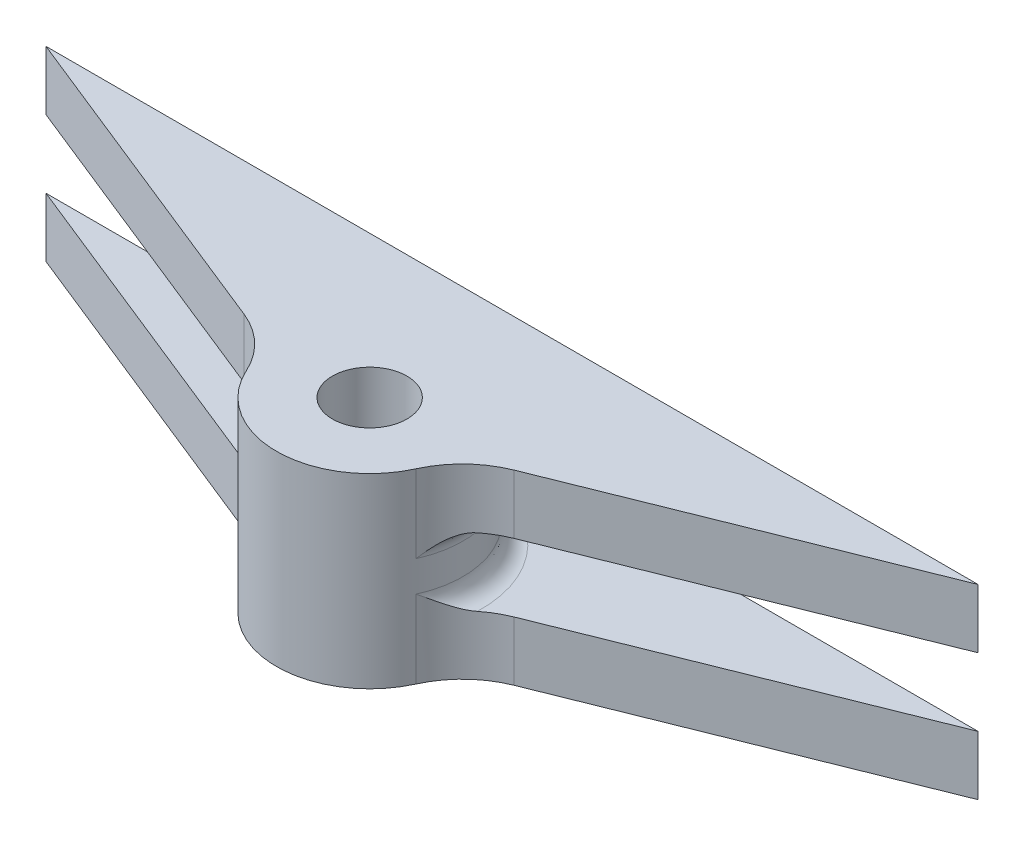
ISO-10303-21;
HEADER;
FILE_DESCRIPTION(('STEP AP214'),'2;1');
FILE_NAME('part.step','',(''),(''),'','','');
FILE_SCHEMA(('AUTOMOTIVE_DESIGN { 1 0 10303 214 1 1 1 1 }'));
ENDSEC;
DATA;
#1=APPLICATION_CONTEXT('core data for automotive mechanical design processes');
#2=APPLICATION_PROTOCOL_DEFINITION('international standard','automotive_design',2000,#1);
#3=PRODUCT_CONTEXT('',#1,'mechanical');
#4=PRODUCT('Part','Part','',(#3));
#5=PRODUCT_RELATED_PRODUCT_CATEGORY('part','',(#4));
#6=PRODUCT_DEFINITION_FORMATION('','',#4);
#7=PRODUCT_DEFINITION_CONTEXT('part definition',#1,'design');
#8=PRODUCT_DEFINITION('design','',#6,#7);
#9=PRODUCT_DEFINITION_SHAPE('','',#8);
#10=(LENGTH_UNIT() NAMED_UNIT(*) SI_UNIT(.MILLI.,.METRE.));
#11=(NAMED_UNIT(*) PLANE_ANGLE_UNIT() SI_UNIT($,.RADIAN.));
#12=(NAMED_UNIT(*) SI_UNIT($,.STERADIAN.) SOLID_ANGLE_UNIT());
#13=UNCERTAINTY_MEASURE_WITH_UNIT(LENGTH_MEASURE(1.E-05),#10,'distance_accuracy_value','');
#14=(GEOMETRIC_REPRESENTATION_CONTEXT(3) GLOBAL_UNCERTAINTY_ASSIGNED_CONTEXT((#13)) GLOBAL_UNIT_ASSIGNED_CONTEXT((#10,
#11,#12)) REPRESENTATION_CONTEXT('',''));
#15=CARTESIAN_POINT('',(0.,0.,0.));
#16=DIRECTION('',(0.,0.,1.));
#17=DIRECTION('',(1.,0.,0.));
#18=AXIS2_PLACEMENT_3D('',#15,#16,#17);
#19=CARTESIAN_POINT('',(13.8867378227828,6.35,34.5808081877734));
#20=DIRECTION('',(-0.372649135552235,0.,-0.927972317352286));
#21=DIRECTION('',(-0.927972317352286,0.,0.372649135552235));
#22=AXIS2_PLACEMENT_3D('',#19,#20,#21);
#23=PLANE('',#22);
#24=DIRECTION('',(0.927972317352286,0.,-0.372649135552235));
#25=VECTOR('',#24,1.);
#26=CARTESIAN_POINT('',(13.8867378227828,6.35,34.5808081877734));
#27=LINE('',#26,#25);
#28=CARTESIAN_POINT('',(64.4822304780552,6.35,14.2629967097085));
#29=VERTEX_POINT('',#28);
#30=CARTESIAN_POINT('',(100.,6.35,0.));
#31=VERTEX_POINT('',#30);
#32=EDGE_CURVE('E189',#29,#31,#27,.T.);
#33=ORIENTED_EDGE('',*,*,#32,.F.);
#34=DIRECTION('',(0.,1.,0.));
#35=VECTOR('',#34,1.);
#36=CARTESIAN_POINT('',(64.4822304780552,0.,14.2629967097085));
#37=LINE('',#36,#35);
#38=CARTESIAN_POINT('',(64.4822304780552,0.,14.2629967097085));
#39=VERTEX_POINT('',#38);
#40=EDGE_CURVE('E209',#29,#39,#37,.F.);
#41=ORIENTED_EDGE('',*,*,#40,.T.);
#42=DIRECTION('',(0.927972317352286,0.,-0.372649135552235));
#43=VECTOR('',#42,1.);
#44=CARTESIAN_POINT('',(13.8867378227828,0.,34.5808081877734));
#45=LINE('',#44,#43);
#46=CARTESIAN_POINT('',(100.,0.,0.));
#47=VERTEX_POINT('',#46);
#48=EDGE_CURVE('E184',#39,#47,#45,.T.);
#49=ORIENTED_EDGE('',*,*,#48,.T.);
#50=DIRECTION('',(0.,-1.,0.));
#51=VECTOR('',#50,1.);
#52=CARTESIAN_POINT('',(100.,6.35,0.));
#53=LINE('',#52,#51);
#54=EDGE_CURVE('E206',#31,#47,#53,.T.);
#55=ORIENTED_EDGE('',*,*,#54,.F.);
#56=EDGE_LOOP('',(#33,#41,#49,#55));
#57=FACE_BOUND('',#56,.T.);
#58=ADVANCED_FACE('F34',(#57),#23,.F.);
#59=CARTESIAN_POINT('',(0.,6.35,0.));
#60=DIRECTION('',(0.,0.,-1.));
#61=DIRECTION('',(-1.,0.,0.));
#62=AXIS2_PLACEMENT_3D('',#59,#60,#61);
#63=PLANE('',#62);
#64=DIRECTION('',(1.,0.,0.));
#65=VECTOR('',#64,1.);
#66=CARTESIAN_POINT('',(0.,0.,0.));
#67=LINE('',#66,#65);
#68=CARTESIAN_POINT('',(0.,0.,0.));
#69=VERTEX_POINT('',#68);
#70=EDGE_CURVE('E200',#69,#47,#67,.T.);
#71=ORIENTED_EDGE('',*,*,#70,.F.);
#72=DIRECTION('',(0.,-1.,0.));
#73=VECTOR('',#72,1.);
#74=CARTESIAN_POINT('',(0.,6.35,0.));
#75=LINE('',#74,#73);
#76=CARTESIAN_POINT('',(0.,6.35,0.));
#77=VERTEX_POINT('',#76);
#78=EDGE_CURVE('E198',#77,#69,#75,.T.);
#79=ORIENTED_EDGE('',*,*,#78,.F.);
#80=DIRECTION('',(1.,0.,0.));
#81=VECTOR('',#80,1.);
#82=CARTESIAN_POINT('',(0.,6.35,0.));
#83=LINE('',#82,#81);
#84=EDGE_CURVE('E191',#77,#31,#83,.T.);
#85=ORIENTED_EDGE('',*,*,#84,.T.);
#86=ORIENTED_EDGE('',*,*,#54,.T.);
#87=EDGE_LOOP('',(#71,#79,#85,#86));
#88=FACE_BOUND('',#87,.T.);
#89=ADVANCED_FACE('F319',(#88),#63,.T.);
#90=CARTESIAN_POINT('',(0.,6.35,0.));
#91=DIRECTION('',(0.372649135552235,0.,-0.927972317352286));
#92=DIRECTION('',(-0.927972317352286,0.,-0.372649135552235));
#93=AXIS2_PLACEMENT_3D('',#90,#91,#92);
#94=PLANE('',#93);
#95=DIRECTION('',(0.927972317352286,0.,0.372649135552235));
#96=VECTOR('',#95,1.);
#97=CARTESIAN_POINT('',(0.,0.,0.));
#98=LINE('',#97,#96);
#99=CARTESIAN_POINT('',(35.5177695219448,0.,14.2629967097085));
#100=VERTEX_POINT('',#99);
#101=EDGE_CURVE('E192',#69,#100,#98,.T.);
#102=ORIENTED_EDGE('',*,*,#101,.T.);
#103=DIRECTION('',(0.,1.,0.));
#104=VECTOR('',#103,1.);
#105=CARTESIAN_POINT('',(35.5177695219448,6.35,14.2629967097085));
#106=LINE('',#105,#104);
#107=CARTESIAN_POINT('',(35.5177695219448,6.35,14.2629967097085));
#108=VERTEX_POINT('',#107);
#109=EDGE_CURVE('E222',#100,#108,#106,.T.);
#110=ORIENTED_EDGE('',*,*,#109,.T.);
#111=DIRECTION('',(0.927972317352286,0.,0.372649135552235));
#112=VECTOR('',#111,1.);
#113=CARTESIAN_POINT('',(0.,6.35,0.));
#114=LINE('',#113,#112);
#115=EDGE_CURVE('E195',#77,#108,#114,.T.);
#116=ORIENTED_EDGE('',*,*,#115,.F.);
#117=ORIENTED_EDGE('',*,*,#78,.T.);
#118=EDGE_LOOP('',(#102,#110,#116,#117));
#119=FACE_BOUND('',#118,.T.);
#120=ADVANCED_FACE('F316',(#119),#94,.F.);
#121=CARTESIAN_POINT('',(0.,6.35,0.));
#122=DIRECTION('',(0.,1.,0.));
#123=DIRECTION('',(0.,0.,1.));
#124=AXIS2_PLACEMENT_3D('',#121,#122,#123);
#125=PLANE('',#124);
#126=CARTESIAN_POINT('',(31.7912781664225,6.35,23.5427198832314));
#127=DIRECTION('',(0.,1.,0.));
#128=DIRECTION('',(0.,0.,1.));
#129=AXIS2_PLACEMENT_3D('',#126,#127,#128);
#130=CIRCLE('',#129,10.);
#131=CARTESIAN_POINT('',(38.0080797720312,6.35,15.7100078499379));
#132=VERTEX_POINT('',#131);
#133=EDGE_CURVE('E234',#108,#132,#130,.F.);
#134=ORIENTED_EDGE('',*,*,#133,.T.);
#135=CARTESIAN_POINT('',(50.,6.35,15.2697247069124));
#136=DIRECTION('',(0.,1.,0.));
#137=DIRECTION('',(0.,0.,1.));
#138=AXIS2_PLACEMENT_3D('',#135,#136,#137);
#139=CIRCLE('',#138,12.);
#140=CARTESIAN_POINT('',(61.9919202279688,6.35,15.7100078499379));
#141=VERTEX_POINT('',#140);
#142=EDGE_CURVE('E250',#132,#141,#139,.F.);
#143=ORIENTED_EDGE('',*,*,#142,.T.);
#144=CARTESIAN_POINT('',(68.2087218335775,6.35,23.5427198832314));
#145=DIRECTION('',(0.,1.,0.));
#146=DIRECTION('',(0.,0.,1.));
#147=AXIS2_PLACEMENT_3D('',#144,#145,#146);
#148=CIRCLE('',#147,10.);
#149=EDGE_CURVE('E230',#141,#29,#148,.F.);
#150=ORIENTED_EDGE('',*,*,#149,.T.);
#151=ORIENTED_EDGE('',*,*,#32,.T.);
#152=ORIENTED_EDGE('',*,*,#84,.F.);
#153=ORIENTED_EDGE('',*,*,#115,.T.);
#154=EDGE_LOOP('',(#134,#143,#150,#151,#152,#153));
#155=FACE_BOUND('',#154,.T.);
#156=ADVANCED_FACE('F311',(#155),#125,.T.);
#157=CARTESIAN_POINT('',(0.,0.,0.));
#158=DIRECTION('',(0.,1.,0.));
#159=DIRECTION('',(0.,0.,1.));
#160=AXIS2_PLACEMENT_3D('',#157,#158,#159);
#161=PLANE('',#160);
#162=ORIENTED_EDGE('',*,*,#48,.F.);
#163=CARTESIAN_POINT('',(68.2087218335775,0.,23.5427198832314));
#164=DIRECTION('',(0.,1.,0.));
#165=DIRECTION('',(0.,0.,1.));
#166=AXIS2_PLACEMENT_3D('',#163,#164,#165);
#167=CIRCLE('',#166,10.);
#168=CARTESIAN_POINT('',(59.1043609167888,0.,19.4062222950719));
#169=VERTEX_POINT('',#168);
#170=EDGE_CURVE('E228',#39,#169,#167,.T.);
#171=ORIENTED_EDGE('',*,*,#170,.T.);
#172=CARTESIAN_POINT('',(50.,0.,15.2697247069124));
#173=DIRECTION('',(0.,1.,0.));
#174=DIRECTION('',(0.,0.,1.));
#175=AXIS2_PLACEMENT_3D('',#172,#173,#174);
#176=CIRCLE('',#175,10.);
#177=CARTESIAN_POINT('',(40.8956390832112,0.,19.4062222950719));
#178=VERTEX_POINT('',#177);
#179=EDGE_CURVE('E181',#178,#169,#176,.T.);
#180=ORIENTED_EDGE('',*,*,#179,.F.);
#181=CARTESIAN_POINT('',(31.7912781664225,0.,23.5427198832314));
#182=DIRECTION('',(0.,1.,0.));
#183=DIRECTION('',(0.,0.,1.));
#184=AXIS2_PLACEMENT_3D('',#181,#182,#183);
#185=CIRCLE('',#184,10.);
#186=EDGE_CURVE('E232',#178,#100,#185,.T.);
#187=ORIENTED_EDGE('',*,*,#186,.T.);
#188=ORIENTED_EDGE('',*,*,#101,.F.);
#189=ORIENTED_EDGE('',*,*,#70,.T.);
#190=EDGE_LOOP('',(#162,#171,#180,#187,#188,#189));
#191=FACE_BOUND('',#190,.T.);
#192=CARTESIAN_POINT('',(50.,0.,15.2697247069124));
#193=DIRECTION('',(0.,1.,0.));
#194=DIRECTION('',(0.,0.,1.));
#195=AXIS2_PLACEMENT_3D('',#192,#193,#194);
#196=CIRCLE('',#195,4.00000000000001);
#197=CARTESIAN_POINT('',(50.,0.,19.2697247069124));
#198=VERTEX_POINT('',#197);
#199=EDGE_CURVE('E153',#198,#198,#196,.T.);
#200=ORIENTED_EDGE('',*,*,#199,.T.);
#201=EDGE_LOOP('',(#200));
#202=FACE_BOUND('',#201,.T.);
#203=ADVANCED_FACE('F303',(#191,#202),#161,.F.);
#204=CARTESIAN_POINT('',(50.,20.,15.2697247069124));
#205=DIRECTION('',(0.,-1.,0.));
#206=DIRECTION('',(0.,0.,-1.));
#207=AXIS2_PLACEMENT_3D('',#204,#205,#206);
#208=CYLINDRICAL_SURFACE('',#207,10.);
#209=DIRECTION('',(0.,-1.,0.));
#210=VECTOR('',#209,1.);
#211=CARTESIAN_POINT('',(40.8956390832112,20.,19.4062222950719));
#212=LINE('',#211,#210);
#213=CARTESIAN_POINT('',(40.8956390832112,20.,19.4062222950719));
#214=VERTEX_POINT('',#213);
#215=CARTESIAN_POINT('',(40.8956390832112,11.65,19.4062222950719));
#216=VERTEX_POINT('',#215);
#217=EDGE_CURVE('E215',#214,#216,#212,.T.);
#218=ORIENTED_EDGE('',*,*,#217,.T.);
#219=CARTESIAN_POINT('',(50.,11.65,15.2697247069124));
#220=DIRECTION('',(0.,-1.,0.));
#221=DIRECTION('',(0.,0.,-1.));
#222=AXIS2_PLACEMENT_3D('',#219,#220,#221);
#223=CIRCLE('',#222,10.);
#224=CARTESIAN_POINT('',(59.1043609167888,11.65,19.4062222950719));
#225=VERTEX_POINT('',#224);
#226=EDGE_CURVE('E244',#216,#225,#223,.T.);
#227=ORIENTED_EDGE('',*,*,#226,.T.);
#228=DIRECTION('',(0.,-1.,0.));
#229=VECTOR('',#228,1.);
#230=CARTESIAN_POINT('',(59.1043609167888,20.,19.4062222950719));
#231=LINE('',#230,#229);
#232=CARTESIAN_POINT('',(59.1043609167888,20.,19.4062222950719));
#233=VERTEX_POINT('',#232);
#234=EDGE_CURVE('E212',#225,#233,#231,.F.);
#235=ORIENTED_EDGE('',*,*,#234,.T.);
#236=CARTESIAN_POINT('',(50.,20.,15.2697247069124));
#237=DIRECTION('',(0.,1.,0.));
#238=DIRECTION('',(0.,0.,1.));
#239=AXIS2_PLACEMENT_3D('',#236,#237,#238);
#240=CIRCLE('',#239,10.);
#241=EDGE_CURVE('E180',#214,#233,#240,.T.);
#242=ORIENTED_EDGE('',*,*,#241,.F.);
#243=EDGE_LOOP('',(#218,#227,#235,#242));
#244=FACE_BOUND('',#243,.T.);
#245=CARTESIAN_POINT('',(50.,8.35,15.2697247069124));
#246=DIRECTION('',(0.,1.,0.));
#247=DIRECTION('',(0.,0.,1.));
#248=AXIS2_PLACEMENT_3D('',#245,#246,#247);
#249=CIRCLE('',#248,10.);
#250=CARTESIAN_POINT('',(59.1043609167888,8.35,19.4062222950719));
#251=VERTEX_POINT('',#250);
#252=CARTESIAN_POINT('',(40.8956390832112,8.35,19.4062222950719));
#253=VERTEX_POINT('',#252);
#254=EDGE_CURVE('E247',#251,#253,#249,.T.);
#255=ORIENTED_EDGE('',*,*,#254,.T.);
#256=DIRECTION('',(0.,-1.,0.));
#257=VECTOR('',#256,1.);
#258=CARTESIAN_POINT('',(40.8956390832112,20.,19.4062222950719));
#259=LINE('',#258,#257);
#260=EDGE_CURVE('E217',#253,#178,#259,.T.);
#261=ORIENTED_EDGE('',*,*,#260,.T.);
#262=ORIENTED_EDGE('',*,*,#179,.T.);
#263=DIRECTION('',(0.,-1.,0.));
#264=VECTOR('',#263,1.);
#265=CARTESIAN_POINT('',(59.1043609167888,20.,19.4062222950719));
#266=LINE('',#265,#264);
#267=EDGE_CURVE('E220',#169,#251,#266,.F.);
#268=ORIENTED_EDGE('',*,*,#267,.T.);
#269=EDGE_LOOP('',(#255,#261,#262,#268));
#270=FACE_BOUND('',#269,.T.);
#271=ADVANCED_FACE('F299',(#244,#270),#208,.T.);
#272=CARTESIAN_POINT('',(50.,20.,15.2697247069124));
#273=DIRECTION('',(0.,-1.,0.));
#274=DIRECTION('',(0.,0.,-1.));
#275=AXIS2_PLACEMENT_3D('',#272,#273,#274);
#276=CYLINDRICAL_SURFACE('',#275,4.00000000000001);
#277=CARTESIAN_POINT('',(50.,20.,15.2697247069124));
#278=DIRECTION('',(0.,1.,0.));
#279=DIRECTION('',(0.,0.,1.));
#280=AXIS2_PLACEMENT_3D('',#277,#278,#279);
#281=CIRCLE('',#280,4.00000000000001);
#282=CARTESIAN_POINT('',(50.,20.,19.2697247069124));
#283=VERTEX_POINT('',#282);
#284=EDGE_CURVE('E177',#283,#283,#281,.T.);
#285=ORIENTED_EDGE('',*,*,#284,.T.);
#286=EDGE_LOOP('',(#285));
#287=FACE_BOUND('',#286,.T.);
#288=ORIENTED_EDGE('',*,*,#199,.F.);
#289=EDGE_LOOP('',(#288));
#290=FACE_BOUND('',#289,.T.);
#291=ADVANCED_FACE('F332',(#287,#290),#276,.F.);
#292=CARTESIAN_POINT('',(0.,20.,0.));
#293=DIRECTION('',(0.,1.,0.));
#294=DIRECTION('',(0.,0.,1.));
#295=AXIS2_PLACEMENT_3D('',#292,#293,#294);
#296=PLANE('',#295);
#297=ORIENTED_EDGE('',*,*,#284,.F.);
#298=EDGE_LOOP('',(#297));
#299=FACE_BOUND('',#298,.T.);
#300=DIRECTION('',(0.927972317352286,0.,0.372649135552235));
#301=VECTOR('',#300,1.);
#302=CARTESIAN_POINT('',(0.,20.,0.));
#303=LINE('',#302,#301);
#304=CARTESIAN_POINT('',(0.,20.,0.));
#305=VERTEX_POINT('',#304);
#306=CARTESIAN_POINT('',(35.5177695219448,20.,14.2629967097085));
#307=VERTEX_POINT('',#306);
#308=EDGE_CURVE('E149',#305,#307,#303,.T.);
#309=ORIENTED_EDGE('',*,*,#308,.T.);
#310=CARTESIAN_POINT('',(31.7912781664225,20.,23.5427198832314));
#311=DIRECTION('',(0.,1.,0.));
#312=DIRECTION('',(0.,0.,1.));
#313=AXIS2_PLACEMENT_3D('',#310,#311,#312);
#314=CIRCLE('',#313,10.);
#315=EDGE_CURVE('E237',#307,#214,#314,.F.);
#316=ORIENTED_EDGE('',*,*,#315,.T.);
#317=ORIENTED_EDGE('',*,*,#241,.T.);
#318=CARTESIAN_POINT('',(68.2087218335775,20.,23.5427198832314));
#319=DIRECTION('',(0.,1.,0.));
#320=DIRECTION('',(0.,0.,1.));
#321=AXIS2_PLACEMENT_3D('',#318,#319,#320);
#322=CIRCLE('',#321,10.);
#323=CARTESIAN_POINT('',(64.4822304780552,20.,14.2629967097085));
#324=VERTEX_POINT('',#323);
#325=EDGE_CURVE('E240',#233,#324,#322,.F.);
#326=ORIENTED_EDGE('',*,*,#325,.T.);
#327=DIRECTION('',(0.927972317352286,0.,-0.372649135552235));
#328=VECTOR('',#327,1.);
#329=CARTESIAN_POINT('',(13.8867378227828,20.,34.5808081877734));
#330=LINE('',#329,#328);
#331=CARTESIAN_POINT('',(100.,20.,0.));
#332=VERTEX_POINT('',#331);
#333=EDGE_CURVE('E168',#324,#332,#330,.T.);
#334=ORIENTED_EDGE('',*,*,#333,.T.);
#335=DIRECTION('',(1.,0.,0.));
#336=VECTOR('',#335,1.);
#337=CARTESIAN_POINT('',(0.,20.,0.));
#338=LINE('',#337,#336);
#339=EDGE_CURVE('E170',#305,#332,#338,.T.);
#340=ORIENTED_EDGE('',*,*,#339,.F.);
#341=EDGE_LOOP('',(#309,#316,#317,#326,#334,#340));
#342=FACE_BOUND('',#341,.T.);
#343=ADVANCED_FACE('F335',(#299,#342),#296,.T.);
#344=CARTESIAN_POINT('',(0.,13.65,0.));
#345=DIRECTION('',(-0.372649135552235,0.,0.927972317352286));
#346=DIRECTION('',(0.927972317352286,0.,0.372649135552235));
#347=AXIS2_PLACEMENT_3D('',#344,#345,#346);
#348=PLANE('',#347);
#349=DIRECTION('',(0.927972317352286,0.,0.372649135552235));
#350=VECTOR('',#349,1.);
#351=CARTESIAN_POINT('',(0.,13.65,0.));
#352=LINE('',#351,#350);
#353=CARTESIAN_POINT('',(0.,13.65,0.));
#354=VERTEX_POINT('',#353);
#355=CARTESIAN_POINT('',(35.5177695219448,13.65,14.2629967097085));
#356=VERTEX_POINT('',#355);
#357=EDGE_CURVE('E146',#354,#356,#352,.T.);
#358=ORIENTED_EDGE('',*,*,#357,.T.);
#359=DIRECTION('',(0.,-1.,0.));
#360=VECTOR('',#359,1.);
#361=CARTESIAN_POINT('',(35.5177695219448,13.65,14.2629967097085));
#362=LINE('',#361,#360);
#363=EDGE_CURVE('E224',#356,#307,#362,.F.);
#364=ORIENTED_EDGE('',*,*,#363,.T.);
#365=ORIENTED_EDGE('',*,*,#308,.F.);
#366=DIRECTION('',(0.,1.,0.));
#367=VECTOR('',#366,1.);
#368=CARTESIAN_POINT('',(0.,13.65,0.));
#369=LINE('',#368,#367);
#370=EDGE_CURVE('E141',#354,#305,#369,.T.);
#371=ORIENTED_EDGE('',*,*,#370,.F.);
#372=EDGE_LOOP('',(#358,#364,#365,#371));
#373=FACE_BOUND('',#372,.T.);
#374=ADVANCED_FACE('F143',(#373),#348,.T.);
#375=CARTESIAN_POINT('',(0.,13.65,0.));
#376=DIRECTION('',(0.,0.,1.));
#377=DIRECTION('',(1.,0.,0.));
#378=AXIS2_PLACEMENT_3D('',#375,#376,#377);
#379=PLANE('',#378);
#380=ORIENTED_EDGE('',*,*,#339,.T.);
#381=DIRECTION('',(0.,1.,0.));
#382=VECTOR('',#381,1.);
#383=CARTESIAN_POINT('',(100.,13.65,0.));
#384=LINE('',#383,#382);
#385=CARTESIAN_POINT('',(100.,13.65,0.));
#386=VERTEX_POINT('',#385);
#387=EDGE_CURVE('E154',#386,#332,#384,.T.);
#388=ORIENTED_EDGE('',*,*,#387,.F.);
#389=DIRECTION('',(1.,0.,0.));
#390=VECTOR('',#389,1.);
#391=CARTESIAN_POINT('',(0.,13.65,0.));
#392=LINE('',#391,#390);
#393=EDGE_CURVE('E158',#354,#386,#392,.T.);
#394=ORIENTED_EDGE('',*,*,#393,.F.);
#395=ORIENTED_EDGE('',*,*,#370,.T.);
#396=EDGE_LOOP('',(#380,#388,#394,#395));
#397=FACE_BOUND('',#396,.T.);
#398=ADVANCED_FACE('F159',(#397),#379,.F.);
#399=CARTESIAN_POINT('',(13.8867378227828,13.65,34.5808081877734));
#400=DIRECTION('',(0.372649135552235,0.,0.927972317352286));
#401=DIRECTION('',(0.927972317352286,0.,-0.372649135552235));
#402=AXIS2_PLACEMENT_3D('',#399,#400,#401);
#403=PLANE('',#402);
#404=ORIENTED_EDGE('',*,*,#333,.F.);
#405=DIRECTION('',(0.,-1.,0.));
#406=VECTOR('',#405,1.);
#407=CARTESIAN_POINT('',(64.4822304780552,13.65,14.2629967097085));
#408=LINE('',#407,#406);
#409=CARTESIAN_POINT('',(64.4822304780552,13.65,14.2629967097085));
#410=VERTEX_POINT('',#409);
#411=EDGE_CURVE('E226',#324,#410,#408,.T.);
#412=ORIENTED_EDGE('',*,*,#411,.T.);
#413=DIRECTION('',(0.927972317352286,0.,-0.372649135552235));
#414=VECTOR('',#413,1.);
#415=CARTESIAN_POINT('',(13.8867378227828,13.65,34.5808081877734));
#416=LINE('',#415,#414);
#417=EDGE_CURVE('E163',#410,#386,#416,.T.);
#418=ORIENTED_EDGE('',*,*,#417,.T.);
#419=ORIENTED_EDGE('',*,*,#387,.T.);
#420=EDGE_LOOP('',(#404,#412,#418,#419));
#421=FACE_BOUND('',#420,.T.);
#422=ADVANCED_FACE('F347',(#421),#403,.T.);
#423=CARTESIAN_POINT('',(0.,13.65,0.));
#424=DIRECTION('',(0.,-1.,0.));
#425=DIRECTION('',(0.,0.,1.));
#426=AXIS2_PLACEMENT_3D('',#423,#424,#425);
#427=PLANE('',#426);
#428=CARTESIAN_POINT('',(68.2087218335775,13.65,23.5427198832314));
#429=DIRECTION('',(0.,-1.,0.));
#430=DIRECTION('',(0.,0.,-1.));
#431=AXIS2_PLACEMENT_3D('',#428,#429,#430);
#432=CIRCLE('',#431,10.);
#433=CARTESIAN_POINT('',(61.9919202279688,13.65,15.7100078499379));
#434=VERTEX_POINT('',#433);
#435=EDGE_CURVE('E242',#410,#434,#432,.F.);
#436=ORIENTED_EDGE('',*,*,#435,.T.);
#437=CARTESIAN_POINT('',(50.,13.65,15.2697247069124));
#438=DIRECTION('',(0.,-1.,0.));
#439=DIRECTION('',(0.,0.,-1.));
#440=AXIS2_PLACEMENT_3D('',#437,#438,#439);
#441=CIRCLE('',#440,12.);
#442=CARTESIAN_POINT('',(38.0080797720312,13.65,15.7100078499379));
#443=VERTEX_POINT('',#442);
#444=EDGE_CURVE('E252',#434,#443,#441,.F.);
#445=ORIENTED_EDGE('',*,*,#444,.T.);
#446=CARTESIAN_POINT('',(31.7912781664225,13.65,23.5427198832314));
#447=DIRECTION('',(0.,-1.,0.));
#448=DIRECTION('',(0.,0.,-1.));
#449=AXIS2_PLACEMENT_3D('',#446,#447,#448);
#450=CIRCLE('',#449,10.);
#451=EDGE_CURVE('E167',#443,#356,#450,.F.);
#452=ORIENTED_EDGE('',*,*,#451,.T.);
#453=ORIENTED_EDGE('',*,*,#357,.F.);
#454=ORIENTED_EDGE('',*,*,#393,.T.);
#455=ORIENTED_EDGE('',*,*,#417,.F.);
#456=EDGE_LOOP('',(#436,#445,#452,#453,#454,#455));
#457=FACE_BOUND('',#456,.T.);
#458=ADVANCED_FACE('F165',(#457),#427,.T.);
#459=CARTESIAN_POINT('',(68.2087218335775,20.,23.5427198832314));
#460=DIRECTION('',(0.,-1.,0.));
#461=DIRECTION('',(0.,0.,-1.));
#462=AXIS2_PLACEMENT_3D('',#459,#460,#461);
#463=CYLINDRICAL_SURFACE('',#462,10.);
#464=ORIENTED_EDGE('',*,*,#149,.F.);
#465=CARTESIAN_POINT('',(61.9919202279688,6.35,15.7100078499379));
#466=CARTESIAN_POINT('',(61.9052059865774,6.35001659971555,15.7788140701271));
#467=CARTESIAN_POINT('',(61.81974791881,6.35530447668634,15.8490062602737));
#468=CARTESIAN_POINT('',(61.6519904487955,6.37509751614533,15.991476480594));
#469=CARTESIAN_POINT('',(61.5696844627345,6.38958221430969,16.0637495405226));
#470=CARTESIAN_POINT('',(61.4094206892017,6.42624213230136,16.2091597580932));
#471=CARTESIAN_POINT('',(61.3314236316806,6.44832650185,16.2822772648007));
#472=CARTESIAN_POINT('',(61.1788808466349,6.49913532699361,16.4298720090517));
#473=CARTESIAN_POINT('',(61.1043375885006,6.52786444811496,16.5043501679596));
#474=CARTESIAN_POINT('',(60.9075335346471,6.61320461288626,16.7071969993536));
#475=CARTESIAN_POINT('',(60.7886406368793,6.67520235684711,16.8365775870082));
#476=CARTESIAN_POINT('',(60.5608581212809,6.81159919812943,17.0975490788901));
#477=CARTESIAN_POINT('',(60.4519742192765,6.88600531407271,17.2291411959415));
#478=CARTESIAN_POINT('',(60.2429150239693,7.0446026163996,17.4950169360256));
#479=CARTESIAN_POINT('',(60.1428026432432,7.1288557434081,17.6293126553589));
#480=CARTESIAN_POINT('',(59.9514281535084,7.3041706807307,17.8996258414796));
#481=CARTESIAN_POINT('',(59.8601638550583,7.39523079674015,18.0356428728654));
#482=CARTESIAN_POINT('',(59.646095963724,7.6245965866227,18.3719056520412));
#483=CARTESIAN_POINT('',(59.5278288752277,7.76555218335953,18.5732247561501));
#484=CARTESIAN_POINT('',(59.3070998537538,8.0518250354426,18.9804172326253));
#485=CARTESIAN_POINT('',(59.204599794656,8.19713072100383,19.1862781973405));
#486=CARTESIAN_POINT('',(59.1076591265805,8.3449604835358,19.3989687676233));
#487=CARTESIAN_POINT('',(59.1060089387593,8.34748024722259,19.4025950477921));
#488=CARTESIAN_POINT('',(59.1043609167888,8.35,19.4062222950719));
#489=B_SPLINE_CURVE_WITH_KNOTS('',3,(#465,#466,#467,#468,#469,#470,#471,#472,#473,#474,#475,
#476,#477,#478,#479,#480,#481,#482,#483,#484,#485,#486,#487,#488),.UNSPECIFIED.,.F.,.F.,(4,2,2,
2,2,2,2,2,2,2,2,4),(0.,0.331771925344564,0.662808182667428,0.99001715738176,1.31745657886539,
1.87550606573698,2.43387228282673,2.99596181518056,3.5579119026198,4.37547171740084,
5.1910224218076,5.2051645592352),.UNSPECIFIED.);
#490=EDGE_CURVE('E261',#141,#251,#489,.T.);
#491=ORIENTED_EDGE('',*,*,#490,.T.);
#492=ORIENTED_EDGE('',*,*,#267,.F.);
#493=ORIENTED_EDGE('',*,*,#170,.F.);
#494=ORIENTED_EDGE('',*,*,#40,.F.);
#495=EDGE_LOOP('',(#464,#491,#492,#493,#494));
#496=FACE_BOUND('',#495,.T.);
#497=ADVANCED_FACE('F274',(#496),#463,.F.);
#498=CARTESIAN_POINT('',(31.7912781664225,20.,23.5427198832314));
#499=DIRECTION('',(0.,-1.,0.));
#500=DIRECTION('',(0.,0.,-1.));
#501=AXIS2_PLACEMENT_3D('',#498,#499,#500);
#502=CYLINDRICAL_SURFACE('',#501,10.);
#503=ORIENTED_EDGE('',*,*,#133,.F.);
#504=ORIENTED_EDGE('',*,*,#109,.F.);
#505=ORIENTED_EDGE('',*,*,#186,.F.);
#506=ORIENTED_EDGE('',*,*,#260,.F.);
#507=CARTESIAN_POINT('',(38.0080797720312,6.35,15.7100078499379));
#508=CARTESIAN_POINT('',(38.0947940134227,6.35001659971555,15.7788140701272));
#509=CARTESIAN_POINT('',(38.1802520811902,6.35530447668635,15.8490062602739));
#510=CARTESIAN_POINT('',(38.3480095512049,6.37509751614539,15.9914764805943));
#511=CARTESIAN_POINT('',(38.430315537266,6.38958221430977,16.063749540523));
#512=CARTESIAN_POINT('',(38.5905793107987,6.42624213230148,16.2091597580936));
#513=CARTESIAN_POINT('',(38.6685763683197,6.44832650185011,16.282277264801));
#514=CARTESIAN_POINT('',(38.8211191533653,6.49913532699368,16.4298720090519));
#515=CARTESIAN_POINT('',(38.8956624114995,6.527864448115,16.5043501679597));
#516=CARTESIAN_POINT('',(39.0924664653528,6.61320461288623,16.7071969993535));
#517=CARTESIAN_POINT('',(39.2113593631206,6.67520235684705,16.8365775870081));
#518=CARTESIAN_POINT('',(39.4391418787189,6.81159919812927,17.0975490788898));
#519=CARTESIAN_POINT('',(39.5480257807233,6.88600531407248,17.2291411959411));
#520=CARTESIAN_POINT('',(39.7570849760304,7.04460261639943,17.4950169360252));
#521=CARTESIAN_POINT('',(39.8571973567566,7.12885574340805,17.6293126553586));
#522=CARTESIAN_POINT('',(40.0485718464915,7.30417068073052,17.8996258414796));
#523=CARTESIAN_POINT('',(40.1398361449418,7.39523079673971,18.0356428728656));
#524=CARTESIAN_POINT('',(40.3539040362759,7.62459658662332,18.3719056520409));
#525=CARTESIAN_POINT('',(40.4721711247717,7.76555218336224,18.5732247561486));
#526=CARTESIAN_POINT('',(40.6929001462469,8.05182503543998,18.9804172326269));
#527=CARTESIAN_POINT('',(40.7954002053467,8.19713072099382,19.1862781973463));
#528=CARTESIAN_POINT('',(40.8923408734196,8.34496048353547,19.3989687676235));
#529=CARTESIAN_POINT('',(40.8939910612408,8.34748024722242,19.4025950477922));
#530=CARTESIAN_POINT('',(40.8956390832112,8.35,19.4062222950719));
#531=B_SPLINE_CURVE_WITH_KNOTS('',3,(#507,#508,#509,#510,#511,#512,#513,#514,#515,#516,#517,
#518,#519,#520,#521,#522,#523,#524,#525,#526,#527,#528,#529,#530),.UNSPECIFIED.,.F.,.F.,(4,2,2,
2,2,2,2,2,2,2,2,4),(0.,0.331771925344929,0.662808182668167,0.990017157382138,1.3174565788654,
1.87550606573668,2.43387228282617,2.99596181518034,3.55791190261983,4.37547171740098,
5.19102242180763,5.2051645592352),.UNSPECIFIED.);
#532=EDGE_CURVE('E254',#253,#132,#531,.F.);
#533=ORIENTED_EDGE('',*,*,#532,.T.);
#534=EDGE_LOOP('',(#503,#504,#505,#506,#533));
#535=FACE_BOUND('',#534,.T.);
#536=ADVANCED_FACE('F269',(#535),#502,.F.);
#537=CARTESIAN_POINT('',(31.7912781664225,20.,23.5427198832314));
#538=DIRECTION('',(0.,-1.,0.));
#539=DIRECTION('',(0.,0.,-1.));
#540=AXIS2_PLACEMENT_3D('',#537,#538,#539);
#541=CYLINDRICAL_SURFACE('',#540,10.);
#542=ORIENTED_EDGE('',*,*,#451,.F.);
#543=CARTESIAN_POINT('',(38.0080797720312,13.65,15.7100078499379));
#544=CARTESIAN_POINT('',(38.0947940134227,13.6499834002845,15.7788140701272));
#545=CARTESIAN_POINT('',(38.1802520811902,13.6446955233136,15.8490062602739));
#546=CARTESIAN_POINT('',(38.3480095512049,13.6249024838546,15.9914764805943));
#547=CARTESIAN_POINT('',(38.430315537266,13.6104177856902,16.063749540523));
#548=CARTESIAN_POINT('',(38.5905793107987,13.5737578676985,16.2091597580936));
#549=CARTESIAN_POINT('',(38.6685763683197,13.5516734981499,16.282277264801));
#550=CARTESIAN_POINT('',(38.8211191533653,13.5008646730063,16.4298720090519));
#551=CARTESIAN_POINT('',(38.8956624114995,13.472135551885,16.5043501679597));
#552=CARTESIAN_POINT('',(39.0924664653528,13.3867953871138,16.7071969993535));
#553=CARTESIAN_POINT('',(39.2113593631206,13.3247976431529,16.8365775870081));
#554=CARTESIAN_POINT('',(39.4391418787189,13.1884008018707,17.0975490788898));
#555=CARTESIAN_POINT('',(39.5480257807233,13.1139946859275,17.2291411959411));
#556=CARTESIAN_POINT('',(39.7570849760304,12.9553973836006,17.4950169360252));
#557=CARTESIAN_POINT('',(39.8571973567566,12.8711442565919,17.6293126553586));
#558=CARTESIAN_POINT('',(40.0485718464915,12.6958293192695,17.8996258414796));
#559=CARTESIAN_POINT('',(40.1398361449418,12.6047692032603,18.0356428728656));
#560=CARTESIAN_POINT('',(40.3539040362759,12.3754034133767,18.3719056520409));
#561=CARTESIAN_POINT('',(40.4721711247717,12.2344478166378,18.5732247561486));
#562=CARTESIAN_POINT('',(40.6929001462469,11.94817496456,18.9804172326269));
#563=CARTESIAN_POINT('',(40.7954002053467,11.8028692790062,19.1862781973463));
#564=CARTESIAN_POINT('',(40.8923408734196,11.6550395164645,19.3989687676235));
#565=CARTESIAN_POINT('',(40.8939910612408,11.6525197527776,19.4025950477922));
#566=CARTESIAN_POINT('',(40.8956390832112,11.65,19.4062222950719));
#567=B_SPLINE_CURVE_WITH_KNOTS('',3,(#543,#544,#545,#546,#547,#548,#549,#550,#551,#552,#553,
#554,#555,#556,#557,#558,#559,#560,#561,#562,#563,#564,#565,#566),.UNSPECIFIED.,.F.,.F.,(4,2,2,
2,2,2,2,2,2,2,2,4),(0.,0.331771925344921,0.66280818266816,0.990017157382138,1.3174565788654,
1.87550606573668,2.43387228282617,2.99596181518034,3.55791190261983,4.37547171740098,
5.19102242180763,5.2051645592352),.UNSPECIFIED.);
#568=EDGE_CURVE('E48',#443,#216,#567,.T.);
#569=ORIENTED_EDGE('',*,*,#568,.T.);
#570=ORIENTED_EDGE('',*,*,#217,.F.);
#571=ORIENTED_EDGE('',*,*,#315,.F.);
#572=ORIENTED_EDGE('',*,*,#363,.F.);
#573=EDGE_LOOP('',(#542,#569,#570,#571,#572));
#574=FACE_BOUND('',#573,.T.);
#575=ADVANCED_FACE('F273',(#574),#541,.F.);
#576=CARTESIAN_POINT('',(68.2087218335775,20.,23.5427198832314));
#577=DIRECTION('',(0.,-1.,0.));
#578=DIRECTION('',(0.,0.,-1.));
#579=AXIS2_PLACEMENT_3D('',#576,#577,#578);
#580=CYLINDRICAL_SURFACE('',#579,10.);
#581=ORIENTED_EDGE('',*,*,#435,.F.);
#582=ORIENTED_EDGE('',*,*,#411,.F.);
#583=ORIENTED_EDGE('',*,*,#325,.F.);
#584=ORIENTED_EDGE('',*,*,#234,.F.);
#585=CARTESIAN_POINT('',(61.9919202279688,13.65,15.7100078499379));
#586=CARTESIAN_POINT('',(61.9052059865774,13.6499834002845,15.7788140701271));
#587=CARTESIAN_POINT('',(61.81974791881,13.6446955233137,15.8490062602737));
#588=CARTESIAN_POINT('',(61.6519904487955,13.6249024838547,15.9914764805939));
#589=CARTESIAN_POINT('',(61.5696844627345,13.6104177856903,16.0637495405226));
#590=CARTESIAN_POINT('',(61.4094206892018,13.5737578676987,16.2091597580931));
#591=CARTESIAN_POINT('',(61.3314236316807,13.55167349815,16.2822772648006));
#592=CARTESIAN_POINT('',(61.1788808466349,13.5008646730064,16.4298720090517));
#593=CARTESIAN_POINT('',(61.1043375885006,13.472135551885,16.5043501679596));
#594=CARTESIAN_POINT('',(60.9075335346471,13.3867953871137,16.7071969993536));
#595=CARTESIAN_POINT('',(60.7886406368793,13.3247976431529,16.8365775870083));
#596=CARTESIAN_POINT('',(60.5608581212808,13.1884008018705,17.0975490788901));
#597=CARTESIAN_POINT('',(60.4519742192764,13.1139946859273,17.2291411959415));
#598=CARTESIAN_POINT('',(60.2429150239693,12.9553973836004,17.4950169360256));
#599=CARTESIAN_POINT('',(60.1428026432432,12.8711442565919,17.6293126553589));
#600=CARTESIAN_POINT('',(59.9514281535084,12.6958293192693,17.8996258414797));
#601=CARTESIAN_POINT('',(59.8601638550583,12.6047692032598,18.0356428728653));
#602=CARTESIAN_POINT('',(59.646095963724,12.3754034133774,18.3719056520413));
#603=CARTESIAN_POINT('',(59.5278288752276,12.2344478166409,18.5732247561503));
#604=CARTESIAN_POINT('',(59.3070998537539,11.948174964557,18.9804172326251));
#605=CARTESIAN_POINT('',(59.2045997946564,11.8028692789946,19.1862781973395));
#606=CARTESIAN_POINT('',(59.1076591265805,11.6550395164641,19.3989687676233));
#607=CARTESIAN_POINT('',(59.1060089387593,11.6525197527774,19.402595047792));
#608=CARTESIAN_POINT('',(59.1043609167888,11.65,19.4062222950719));
#609=B_SPLINE_CURVE_WITH_KNOTS('',3,(#585,#586,#587,#588,#589,#590,#591,#592,#593,#594,#595,
#596,#597,#598,#599,#600,#601,#602,#603,#604,#605,#606,#607,#608),.UNSPECIFIED.,.F.,.F.,(4,2,2,
2,2,2,2,2,2,2,2,4),(0.,0.331771925344517,0.662808182667319,0.9900171573817,1.31745657886539,
1.87550606573703,2.43387228282683,2.99596181518061,3.55791190261981,4.37547171740083,
5.1910224218076,5.2051645592352),.UNSPECIFIED.);
#610=EDGE_CURVE('E11',#225,#434,#609,.F.);
#611=ORIENTED_EDGE('',*,*,#610,.T.);
#612=EDGE_LOOP('',(#581,#582,#583,#584,#611));
#613=FACE_BOUND('',#612,.T.);
#614=ADVANCED_FACE('F280',(#613),#580,.F.);
#615=CARTESIAN_POINT('',(50.,8.35,15.2697247069124));
#616=DIRECTION('',(0.,1.,0.));
#617=DIRECTION('',(0.,0.,1.));
#618=AXIS2_PLACEMENT_3D('',#615,#616,#617);
#619=TOROIDAL_SURFACE('',#618,12.,2.);
#620=ORIENTED_EDGE('',*,*,#490,.F.);
#621=ORIENTED_EDGE('',*,*,#142,.F.);
#622=ORIENTED_EDGE('',*,*,#532,.F.);
#623=ORIENTED_EDGE('',*,*,#254,.F.);
#624=EDGE_LOOP('',(#620,#621,#622,#623));
#625=FACE_BOUND('',#624,.T.);
#626=ADVANCED_FACE('F267',(#625),#619,.F.);
#627=CARTESIAN_POINT('',(50.,11.65,15.2697247069124));
#628=DIRECTION('',(0.,-1.,0.));
#629=DIRECTION('',(0.,0.,-1.));
#630=AXIS2_PLACEMENT_3D('',#627,#628,#629);
#631=TOROIDAL_SURFACE('',#630,12.,2.);
#632=ORIENTED_EDGE('',*,*,#610,.F.);
#633=ORIENTED_EDGE('',*,*,#226,.F.);
#634=ORIENTED_EDGE('',*,*,#568,.F.);
#635=ORIENTED_EDGE('',*,*,#444,.F.);
#636=EDGE_LOOP('',(#632,#633,#634,#635));
#637=FACE_BOUND('',#636,.T.);
#638=ADVANCED_FACE('F36',(#637),#631,.F.);
#639=CLOSED_SHELL('',(#58,#89,#120,#156,#203,#271,#291,#343,#374,#398,#422,#458,#497,#536,#575,
#614,#626,#638));
#640=MANIFOLD_SOLID_BREP('B2',#639);
#641=ADVANCED_BREP_SHAPE_REPRESENTATION('',(#18,#640),#14);
#642=SHAPE_DEFINITION_REPRESENTATION(#9,#641);
ENDSEC;
END-ISO-10303-21;
